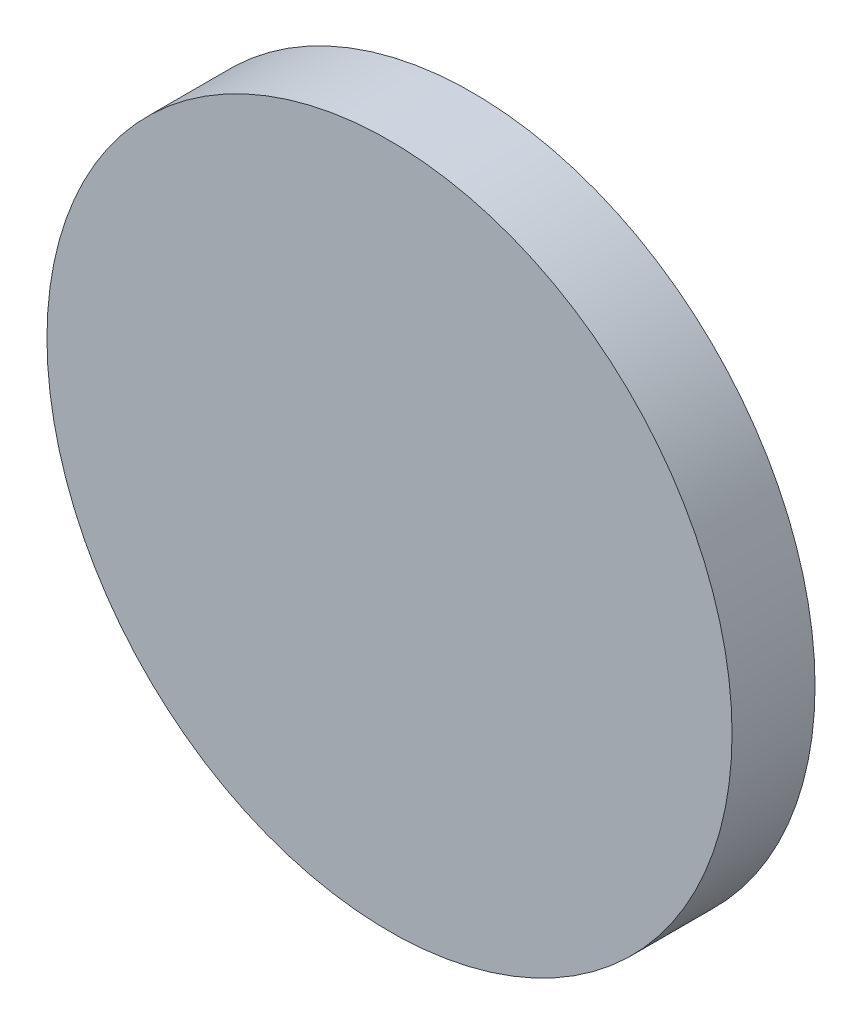
ISO-10303-21;
HEADER;
FILE_DESCRIPTION(('STEP AP214'),'2;1');
FILE_NAME('part.step','',(''),(''),'','','');
FILE_SCHEMA(('AUTOMOTIVE_DESIGN { 1 0 10303 214 1 1 1 1 }'));
ENDSEC;
DATA;
#1=APPLICATION_CONTEXT('core data for automotive mechanical design processes');
#2=APPLICATION_PROTOCOL_DEFINITION('international standard','automotive_design',2000,#1);
#3=PRODUCT_CONTEXT('',#1,'mechanical');
#4=PRODUCT('Part','Part','',(#3));
#5=PRODUCT_RELATED_PRODUCT_CATEGORY('part','',(#4));
#6=PRODUCT_DEFINITION_FORMATION('','',#4);
#7=PRODUCT_DEFINITION_CONTEXT('part definition',#1,'design');
#8=PRODUCT_DEFINITION('design','',#6,#7);
#9=PRODUCT_DEFINITION_SHAPE('','',#8);
#10=(LENGTH_UNIT() NAMED_UNIT(*) SI_UNIT(.MILLI.,.METRE.));
#11=(NAMED_UNIT(*) PLANE_ANGLE_UNIT() SI_UNIT($,.RADIAN.));
#12=(NAMED_UNIT(*) SI_UNIT($,.STERADIAN.) SOLID_ANGLE_UNIT());
#13=UNCERTAINTY_MEASURE_WITH_UNIT(LENGTH_MEASURE(1.E-05),#10,'distance_accuracy_value','');
#14=(GEOMETRIC_REPRESENTATION_CONTEXT(3) GLOBAL_UNCERTAINTY_ASSIGNED_CONTEXT((#13)) GLOBAL_UNIT_ASSIGNED_CONTEXT((#10,
#11,#12)) REPRESENTATION_CONTEXT('',''));
#15=CARTESIAN_POINT('',(0.,0.,0.));
#16=DIRECTION('',(0.,0.,1.));
#17=DIRECTION('',(1.,0.,0.));
#18=AXIS2_PLACEMENT_3D('',#15,#16,#17);
#19=CARTESIAN_POINT('',(0.,-1.33642991471926,20.));
#20=DIRECTION('',(0.,0.,-1.));
#21=DIRECTION('',(-1.,0.,0.));
#22=AXIS2_PLACEMENT_3D('',#19,#20,#21);
#23=CYLINDRICAL_SURFACE('',#22,82.55);
#24=CARTESIAN_POINT('',(0.,-1.33642991471926,20.));
#25=DIRECTION('',(0.,0.,1.));
#26=DIRECTION('',(1.,0.,0.));
#27=AXIS2_PLACEMENT_3D('',#24,#25,#26);
#28=CIRCLE('',#27,82.55);
#29=CARTESIAN_POINT('',(82.55,-1.33642991471926,20.));
#30=VERTEX_POINT('',#29);
#31=EDGE_CURVE('E10',#30,#30,#28,.T.);
#32=ORIENTED_EDGE('',*,*,#31,.F.);
#33=EDGE_LOOP('',(#32));
#34=FACE_BOUND('',#33,.T.);
#35=CARTESIAN_POINT('',(0.,-1.33642991471926,0.));
#36=DIRECTION('',(0.,0.,1.));
#37=DIRECTION('',(1.,0.,0.));
#38=AXIS2_PLACEMENT_3D('',#35,#36,#37);
#39=CIRCLE('',#38,82.55);
#40=CARTESIAN_POINT('',(82.55,-1.33642991471926,0.));
#41=VERTEX_POINT('',#40);
#42=EDGE_CURVE('E33',#41,#41,#39,.T.);
#43=ORIENTED_EDGE('',*,*,#42,.T.);
#44=EDGE_LOOP('',(#43));
#45=FACE_BOUND('',#44,.T.);
#46=ADVANCED_FACE('F30',(#34,#45),#23,.T.);
#47=CARTESIAN_POINT('',(0.,-1.33642991471926,20.));
#48=DIRECTION('',(0.,0.,1.));
#49=DIRECTION('',(1.,0.,0.));
#50=AXIS2_PLACEMENT_3D('',#47,#48,#49);
#51=PLANE('',#50);
#52=ORIENTED_EDGE('',*,*,#31,.T.);
#53=EDGE_LOOP('',(#52));
#54=FACE_BOUND('',#53,.T.);
#55=ADVANCED_FACE('F45',(#54),#51,.T.);
#56=CARTESIAN_POINT('',(0.,-1.33642991471926,0.));
#57=DIRECTION('',(0.,0.,1.));
#58=DIRECTION('',(1.,0.,0.));
#59=AXIS2_PLACEMENT_3D('',#56,#57,#58);
#60=PLANE('',#59);
#61=ORIENTED_EDGE('',*,*,#42,.F.);
#62=EDGE_LOOP('',(#61));
#63=FACE_BOUND('',#62,.T.);
#64=ADVANCED_FACE('F43',(#63),#60,.F.);
#65=CLOSED_SHELL('',(#46,#55,#64));
#66=MANIFOLD_SOLID_BREP('B2',#65);
#67=ADVANCED_BREP_SHAPE_REPRESENTATION('',(#18,#66),#14);
#68=SHAPE_DEFINITION_REPRESENTATION(#9,#67);
ENDSEC;
END-ISO-10303-21;
